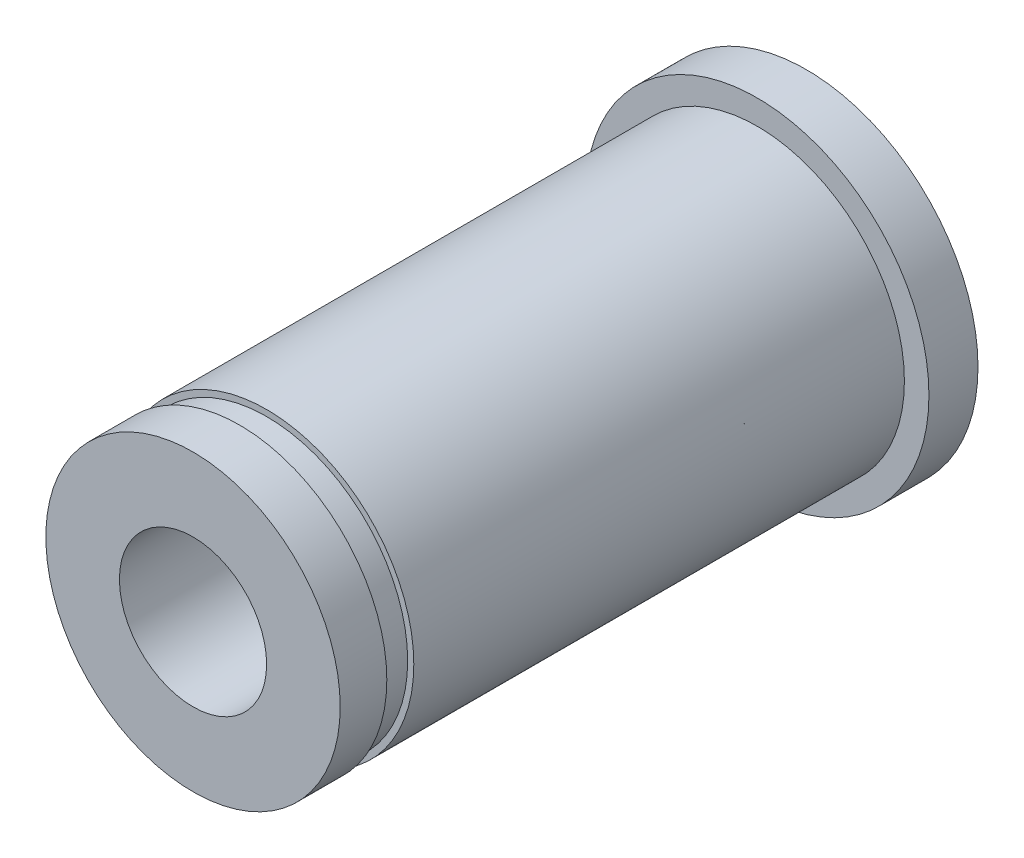
ISO-10303-21;
HEADER;
FILE_DESCRIPTION(('STEP AP214'),'2;1');
FILE_NAME('part.step','',(''),(''),'','','');
FILE_SCHEMA(('AUTOMOTIVE_DESIGN { 1 0 10303 214 1 1 1 1 }'));
ENDSEC;
DATA;
#1=APPLICATION_CONTEXT('core data for automotive mechanical design processes');
#2=APPLICATION_PROTOCOL_DEFINITION('international standard','automotive_design',2000,#1);
#3=PRODUCT_CONTEXT('',#1,'mechanical');
#4=PRODUCT('Part','Part','',(#3));
#5=PRODUCT_RELATED_PRODUCT_CATEGORY('part','',(#4));
#6=PRODUCT_DEFINITION_FORMATION('','',#4);
#7=PRODUCT_DEFINITION_CONTEXT('part definition',#1,'design');
#8=PRODUCT_DEFINITION('design','',#6,#7);
#9=PRODUCT_DEFINITION_SHAPE('','',#8);
#10=(LENGTH_UNIT() NAMED_UNIT(*) SI_UNIT(.MILLI.,.METRE.));
#11=(NAMED_UNIT(*) PLANE_ANGLE_UNIT() SI_UNIT($,.RADIAN.));
#12=(NAMED_UNIT(*) SI_UNIT($,.STERADIAN.) SOLID_ANGLE_UNIT());
#13=UNCERTAINTY_MEASURE_WITH_UNIT(LENGTH_MEASURE(1.E-05),#10,'distance_accuracy_value','');
#14=(GEOMETRIC_REPRESENTATION_CONTEXT(3) GLOBAL_UNCERTAINTY_ASSIGNED_CONTEXT((#13)) GLOBAL_UNIT_ASSIGNED_CONTEXT((#10,
#11,#12)) REPRESENTATION_CONTEXT('',''));
#15=CARTESIAN_POINT('',(0.,0.,0.));
#16=DIRECTION('',(0.,0.,1.));
#17=DIRECTION('',(1.,0.,0.));
#18=AXIS2_PLACEMENT_3D('',#15,#16,#17);
#19=CARTESIAN_POINT('',(0.,0.,23.));
#20=DIRECTION('',(0.,0.,-1.));
#21=DIRECTION('',(-1.,0.,0.));
#22=AXIS2_PLACEMENT_3D('',#19,#20,#21);
#23=CYLINDRICAL_SURFACE('',#22,6.);
#24=CARTESIAN_POINT('',(0.,0.,0.));
#25=DIRECTION('',(0.,0.,1.));
#26=DIRECTION('',(1.,0.,0.));
#27=AXIS2_PLACEMENT_3D('',#24,#25,#26);
#28=CIRCLE('',#27,6.);
#29=CARTESIAN_POINT('',(6.,0.,0.));
#30=VERTEX_POINT('',#29);
#31=EDGE_CURVE('E42',#30,#30,#28,.T.);
#32=ORIENTED_EDGE('',*,*,#31,.T.);
#33=EDGE_LOOP('',(#32));
#34=FACE_BOUND('',#33,.T.);
#35=CARTESIAN_POINT('',(0.,0.,20.));
#36=DIRECTION('',(0.,0.,1.));
#37=DIRECTION('',(1.,0.,0.));
#38=AXIS2_PLACEMENT_3D('',#35,#36,#37);
#39=CIRCLE('',#38,6.);
#40=CARTESIAN_POINT('',(6.,0.,20.));
#41=VERTEX_POINT('',#40);
#42=EDGE_CURVE('E63',#41,#41,#39,.T.);
#43=ORIENTED_EDGE('',*,*,#42,.F.);
#44=EDGE_LOOP('',(#43));
#45=FACE_BOUND('',#44,.T.);
#46=ADVANCED_FACE('F34',(#34,#45),#23,.T.);
#47=CARTESIAN_POINT('',(0.,0.,-2.));
#48=DIRECTION('',(0.,0.,1.));
#49=DIRECTION('',(1.,0.,0.));
#50=AXIS2_PLACEMENT_3D('',#47,#48,#49);
#51=CYLINDRICAL_SURFACE('',#50,7.);
#52=CARTESIAN_POINT('',(0.,0.,-2.));
#53=DIRECTION('',(0.,0.,-1.));
#54=DIRECTION('',(-1.,0.,0.));
#55=AXIS2_PLACEMENT_3D('',#52,#53,#54);
#56=CIRCLE('',#55,7.);
#57=CARTESIAN_POINT('',(-7.,0.,-2.));
#58=VERTEX_POINT('',#57);
#59=EDGE_CURVE('E47',#58,#58,#56,.T.);
#60=ORIENTED_EDGE('',*,*,#59,.F.);
#61=EDGE_LOOP('',(#60));
#62=FACE_BOUND('',#61,.T.);
#63=CARTESIAN_POINT('',(0.,0.,0.));
#64=DIRECTION('',(0.,0.,-1.));
#65=DIRECTION('',(-1.,0.,0.));
#66=AXIS2_PLACEMENT_3D('',#63,#64,#65);
#67=CIRCLE('',#66,7.);
#68=CARTESIAN_POINT('',(-7.,0.,0.));
#69=VERTEX_POINT('',#68);
#70=EDGE_CURVE('E49',#69,#69,#67,.T.);
#71=ORIENTED_EDGE('',*,*,#70,.T.);
#72=EDGE_LOOP('',(#71));
#73=FACE_BOUND('',#72,.T.);
#74=ADVANCED_FACE('F88',(#62,#73),#51,.T.);
#75=CARTESIAN_POINT('',(0.,0.,-2.));
#76=DIRECTION('',(0.,0.,-1.));
#77=DIRECTION('',(-1.,0.,0.));
#78=AXIS2_PLACEMENT_3D('',#75,#76,#77);
#79=PLANE('',#78);
#80=CARTESIAN_POINT('',(0.,0.,-2.));
#81=DIRECTION('',(0.,0.,-1.));
#82=DIRECTION('',(-1.,0.,0.));
#83=AXIS2_PLACEMENT_3D('',#80,#81,#82);
#84=CIRCLE('',#83,3.);
#85=CARTESIAN_POINT('',(-3.,0.,-2.));
#86=VERTEX_POINT('',#85);
#87=EDGE_CURVE('E66',#86,#86,#84,.T.);
#88=ORIENTED_EDGE('',*,*,#87,.F.);
#89=EDGE_LOOP('',(#88));
#90=FACE_BOUND('',#89,.T.);
#91=ORIENTED_EDGE('',*,*,#59,.T.);
#92=EDGE_LOOP('',(#91));
#93=FACE_BOUND('',#92,.T.);
#94=ADVANCED_FACE('F93',(#90,#93),#79,.T.);
#95=CARTESIAN_POINT('',(0.,0.,0.));
#96=DIRECTION('',(0.,0.,-1.));
#97=DIRECTION('',(-1.,0.,0.));
#98=AXIS2_PLACEMENT_3D('',#95,#96,#97);
#99=PLANE('',#98);
#100=ORIENTED_EDGE('',*,*,#31,.F.);
#101=EDGE_LOOP('',(#100));
#102=FACE_BOUND('',#101,.T.);
#103=ORIENTED_EDGE('',*,*,#70,.F.);
#104=EDGE_LOOP('',(#103));
#105=FACE_BOUND('',#104,.T.);
#106=ADVANCED_FACE('F109',(#102,#105),#99,.F.);
#107=CARTESIAN_POINT('',(-6.,0.,21.1));
#108=DIRECTION('',(0.,0.,-1.));
#109=DIRECTION('',(-1.,0.,0.));
#110=AXIS2_PLACEMENT_3D('',#107,#108,#109);
#111=PLANE('',#110);
#112=CARTESIAN_POINT('',(0.,0.,21.1));
#113=DIRECTION('',(0.,0.,1.));
#114=DIRECTION('',(1.,0.,0.));
#115=AXIS2_PLACEMENT_3D('',#112,#113,#114);
#116=CIRCLE('',#115,5.75);
#117=CARTESIAN_POINT('',(5.75,0.,21.1));
#118=VERTEX_POINT('',#117);
#119=EDGE_CURVE('E57',#118,#118,#116,.T.);
#120=ORIENTED_EDGE('',*,*,#119,.T.);
#121=EDGE_LOOP('',(#120));
#122=FACE_BOUND('',#121,.T.);
#123=CARTESIAN_POINT('',(0.,0.,21.1));
#124=DIRECTION('',(0.,0.,1.));
#125=DIRECTION('',(1.,0.,0.));
#126=AXIS2_PLACEMENT_3D('',#123,#124,#125);
#127=CIRCLE('',#126,6.);
#128=CARTESIAN_POINT('',(6.,0.,21.1));
#129=VERTEX_POINT('',#128);
#130=EDGE_CURVE('E52',#129,#129,#127,.T.);
#131=ORIENTED_EDGE('',*,*,#130,.F.);
#132=EDGE_LOOP('',(#131));
#133=FACE_BOUND('',#132,.T.);
#134=ADVANCED_FACE('F103',(#122,#133),#111,.T.);
#135=CARTESIAN_POINT('',(0.,0.,23.));
#136=DIRECTION('',(0.,0.,1.));
#137=DIRECTION('',(1.,0.,0.));
#138=AXIS2_PLACEMENT_3D('',#135,#136,#137);
#139=CYLINDRICAL_SURFACE('',#138,5.75);
#140=CARTESIAN_POINT('',(0.,0.,20.));
#141=DIRECTION('',(0.,0.,1.));
#142=DIRECTION('',(1.,0.,0.));
#143=AXIS2_PLACEMENT_3D('',#140,#141,#142);
#144=CIRCLE('',#143,5.75);
#145=CARTESIAN_POINT('',(5.75,0.,20.));
#146=VERTEX_POINT('',#145);
#147=EDGE_CURVE('E60',#146,#146,#144,.T.);
#148=ORIENTED_EDGE('',*,*,#147,.T.);
#149=EDGE_LOOP('',(#148));
#150=FACE_BOUND('',#149,.T.);
#151=ORIENTED_EDGE('',*,*,#119,.F.);
#152=EDGE_LOOP('',(#151));
#153=FACE_BOUND('',#152,.T.);
#154=ADVANCED_FACE('F83',(#150,#153),#139,.T.);
#155=CARTESIAN_POINT('',(-6.,0.,20.));
#156=DIRECTION('',(0.,0.,1.));
#157=DIRECTION('',(1.,0.,0.));
#158=AXIS2_PLACEMENT_3D('',#155,#156,#157);
#159=PLANE('',#158);
#160=ORIENTED_EDGE('',*,*,#42,.T.);
#161=EDGE_LOOP('',(#160));
#162=FACE_BOUND('',#161,.T.);
#163=ORIENTED_EDGE('',*,*,#147,.F.);
#164=EDGE_LOOP('',(#163));
#165=FACE_BOUND('',#164,.T.);
#166=ADVANCED_FACE('F77',(#162,#165),#159,.T.);
#167=CARTESIAN_POINT('',(0.,0.,23.));
#168=DIRECTION('',(0.,0.,1.));
#169=DIRECTION('',(1.,0.,0.));
#170=AXIS2_PLACEMENT_3D('',#167,#168,#169);
#171=PLANE('',#170);
#172=CARTESIAN_POINT('',(0.,0.,23.));
#173=DIRECTION('',(0.,0.,1.));
#174=DIRECTION('',(1.,0.,0.));
#175=AXIS2_PLACEMENT_3D('',#172,#173,#174);
#176=CIRCLE('',#175,3.);
#177=CARTESIAN_POINT('',(3.,0.,23.));
#178=VERTEX_POINT('',#177);
#179=EDGE_CURVE('E38',#178,#178,#176,.T.);
#180=ORIENTED_EDGE('',*,*,#179,.F.);
#181=EDGE_LOOP('',(#180));
#182=FACE_BOUND('',#181,.T.);
#183=CARTESIAN_POINT('',(0.,0.,23.));
#184=DIRECTION('',(0.,0.,1.));
#185=DIRECTION('',(1.,0.,0.));
#186=AXIS2_PLACEMENT_3D('',#183,#184,#185);
#187=CIRCLE('',#186,6.);
#188=CARTESIAN_POINT('',(6.,0.,23.));
#189=VERTEX_POINT('',#188);
#190=EDGE_CURVE('E10',#189,#189,#187,.T.);
#191=ORIENTED_EDGE('',*,*,#190,.T.);
#192=EDGE_LOOP('',(#191));
#193=FACE_BOUND('',#192,.T.);
#194=ADVANCED_FACE('F75',(#182,#193),#171,.T.);
#195=ORIENTED_EDGE('',*,*,#190,.F.);
#196=EDGE_LOOP('',(#195));
#197=FACE_BOUND('',#196,.T.);
#198=ORIENTED_EDGE('',*,*,#130,.T.);
#199=EDGE_LOOP('',(#198));
#200=FACE_BOUND('',#199,.T.);
#201=ADVANCED_FACE('F36',(#197,#200),#23,.T.);
#202=CARTESIAN_POINT('',(0.,0.,25.));
#203=DIRECTION('',(0.,0.,-1.));
#204=DIRECTION('',(-1.,0.,0.));
#205=AXIS2_PLACEMENT_3D('',#202,#203,#204);
#206=CYLINDRICAL_SURFACE('',#205,3.);
#207=ORIENTED_EDGE('',*,*,#179,.T.);
#208=EDGE_LOOP('',(#207));
#209=FACE_BOUND('',#208,.T.);
#210=ORIENTED_EDGE('',*,*,#87,.T.);
#211=EDGE_LOOP('',(#210));
#212=FACE_BOUND('',#211,.T.);
#213=ADVANCED_FACE('F73',(#209,#212),#206,.F.);
#214=CLOSED_SHELL('',(#46,#74,#94,#106,#134,#154,#166,#194,#201,#213));
#215=MANIFOLD_SOLID_BREP('B2',#214);
#216=ADVANCED_BREP_SHAPE_REPRESENTATION('',(#18,#215),#14);
#217=SHAPE_DEFINITION_REPRESENTATION(#9,#216);
ENDSEC;
END-ISO-10303-21;
